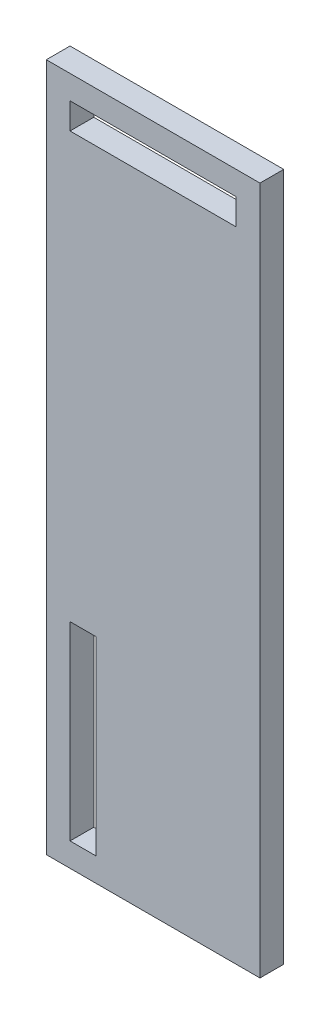
ISO-10303-21;
HEADER;
FILE_DESCRIPTION(('STEP AP214'),'2;1');
FILE_NAME('part.step','',(''),(''),'','','');
FILE_SCHEMA(('AUTOMOTIVE_DESIGN { 1 0 10303 214 1 1 1 1 }'));
ENDSEC;
DATA;
#1=APPLICATION_CONTEXT('core data for automotive mechanical design processes');
#2=APPLICATION_PROTOCOL_DEFINITION('international standard','automotive_design',2000,#1);
#3=PRODUCT_CONTEXT('',#1,'mechanical');
#4=PRODUCT('Part','Part','',(#3));
#5=PRODUCT_RELATED_PRODUCT_CATEGORY('part','',(#4));
#6=PRODUCT_DEFINITION_FORMATION('','',#4);
#7=PRODUCT_DEFINITION_CONTEXT('part definition',#1,'design');
#8=PRODUCT_DEFINITION('design','',#6,#7);
#9=PRODUCT_DEFINITION_SHAPE('','',#8);
#10=(LENGTH_UNIT() NAMED_UNIT(*) SI_UNIT(.MILLI.,.METRE.));
#11=(NAMED_UNIT(*) PLANE_ANGLE_UNIT() SI_UNIT($,.RADIAN.));
#12=(NAMED_UNIT(*) SI_UNIT($,.STERADIAN.) SOLID_ANGLE_UNIT());
#13=UNCERTAINTY_MEASURE_WITH_UNIT(LENGTH_MEASURE(1.E-05),#10,'distance_accuracy_value','');
#14=(GEOMETRIC_REPRESENTATION_CONTEXT(3) GLOBAL_UNCERTAINTY_ASSIGNED_CONTEXT((#13)) GLOBAL_UNIT_ASSIGNED_CONTEXT((#10,
#11,#12)) REPRESENTATION_CONTEXT('',''));
#15=CARTESIAN_POINT('',(0.,0.,0.));
#16=DIRECTION('',(0.,0.,1.));
#17=DIRECTION('',(1.,0.,0.));
#18=AXIS2_PLACEMENT_3D('',#15,#16,#17);
#19=CARTESIAN_POINT('',(28.575,92.075,6.35));
#20=DIRECTION('',(-1.,0.,0.));
#21=DIRECTION('',(0.,0.,1.));
#22=AXIS2_PLACEMENT_3D('',#19,#20,#21);
#23=PLANE('',#22);
#24=DIRECTION('',(0.,1.,0.));
#25=VECTOR('',#24,1.);
#26=CARTESIAN_POINT('',(28.575,92.075,0.));
#27=LINE('',#26,#25);
#28=CARTESIAN_POINT('',(28.575,-92.075,0.));
#29=VERTEX_POINT('',#28);
#30=CARTESIAN_POINT('',(28.575,92.075,0.));
#31=VERTEX_POINT('',#30);
#32=EDGE_CURVE('E181',#29,#31,#27,.T.);
#33=ORIENTED_EDGE('',*,*,#32,.T.);
#34=DIRECTION('',(0.,0.,-1.));
#35=VECTOR('',#34,1.);
#36=CARTESIAN_POINT('',(28.575,92.075,6.35));
#37=LINE('',#36,#35);
#38=CARTESIAN_POINT('',(28.575,92.075,6.35));
#39=VERTEX_POINT('',#38);
#40=EDGE_CURVE('E11',#39,#31,#37,.T.);
#41=ORIENTED_EDGE('',*,*,#40,.F.);
#42=DIRECTION('',(0.,1.,0.));
#43=VECTOR('',#42,1.);
#44=CARTESIAN_POINT('',(28.575,92.075,6.35));
#45=LINE('',#44,#43);
#46=CARTESIAN_POINT('',(28.575,-92.075,6.35));
#47=VERTEX_POINT('',#46);
#48=EDGE_CURVE('E188',#47,#39,#45,.T.);
#49=ORIENTED_EDGE('',*,*,#48,.F.);
#50=DIRECTION('',(0.,0.,-1.));
#51=VECTOR('',#50,1.);
#52=CARTESIAN_POINT('',(28.575,-92.075,6.35));
#53=LINE('',#52,#51);
#54=EDGE_CURVE('E198',#47,#29,#53,.T.);
#55=ORIENTED_EDGE('',*,*,#54,.T.);
#56=EDGE_LOOP('',(#33,#41,#49,#55));
#57=FACE_BOUND('',#56,.T.);
#58=ADVANCED_FACE('F31',(#57),#23,.F.);
#59=CARTESIAN_POINT('',(28.575,92.075,6.35));
#60=DIRECTION('',(0.,-1.,0.));
#61=DIRECTION('',(0.,0.,-1.));
#62=AXIS2_PLACEMENT_3D('',#59,#60,#61);
#63=PLANE('',#62);
#64=DIRECTION('',(-1.,0.,0.));
#65=VECTOR('',#64,1.);
#66=CARTESIAN_POINT('',(28.575,92.075,0.));
#67=LINE('',#66,#65);
#68=CARTESIAN_POINT('',(-28.575,92.075,0.));
#69=VERTEX_POINT('',#68);
#70=EDGE_CURVE('E201',#31,#69,#67,.T.);
#71=ORIENTED_EDGE('',*,*,#70,.T.);
#72=DIRECTION('',(0.,0.,-1.));
#73=VECTOR('',#72,1.);
#74=CARTESIAN_POINT('',(-28.575,92.075,6.35));
#75=LINE('',#74,#73);
#76=CARTESIAN_POINT('',(-28.575,92.075,6.35));
#77=VERTEX_POINT('',#76);
#78=EDGE_CURVE('E38',#77,#69,#75,.T.);
#79=ORIENTED_EDGE('',*,*,#78,.F.);
#80=DIRECTION('',(-1.,0.,0.));
#81=VECTOR('',#80,1.);
#82=CARTESIAN_POINT('',(28.575,92.075,6.35));
#83=LINE('',#82,#81);
#84=EDGE_CURVE('E191',#39,#77,#83,.T.);
#85=ORIENTED_EDGE('',*,*,#84,.F.);
#86=ORIENTED_EDGE('',*,*,#40,.T.);
#87=EDGE_LOOP('',(#71,#79,#85,#86));
#88=FACE_BOUND('',#87,.T.);
#89=ADVANCED_FACE('F230',(#88),#63,.F.);
#90=CARTESIAN_POINT('',(-28.575,92.075,6.35));
#91=DIRECTION('',(1.,0.,0.));
#92=DIRECTION('',(0.,1.,0.));
#93=AXIS2_PLACEMENT_3D('',#90,#91,#92);
#94=PLANE('',#93);
#95=DIRECTION('',(0.,-1.,0.));
#96=VECTOR('',#95,1.);
#97=CARTESIAN_POINT('',(-28.575,92.075,0.));
#98=LINE('',#97,#96);
#99=CARTESIAN_POINT('',(-28.575,-92.075,0.));
#100=VERTEX_POINT('',#99);
#101=EDGE_CURVE('E203',#69,#100,#98,.T.);
#102=ORIENTED_EDGE('',*,*,#101,.T.);
#103=DIRECTION('',(0.,0.,-1.));
#104=VECTOR('',#103,1.);
#105=CARTESIAN_POINT('',(-28.575,-92.075,6.35));
#106=LINE('',#105,#104);
#107=CARTESIAN_POINT('',(-28.575,-92.075,6.35));
#108=VERTEX_POINT('',#107);
#109=EDGE_CURVE('E208',#108,#100,#106,.T.);
#110=ORIENTED_EDGE('',*,*,#109,.F.);
#111=DIRECTION('',(0.,-1.,0.));
#112=VECTOR('',#111,1.);
#113=CARTESIAN_POINT('',(-28.575,92.075,6.35));
#114=LINE('',#113,#112);
#115=EDGE_CURVE('E194',#77,#108,#114,.T.);
#116=ORIENTED_EDGE('',*,*,#115,.F.);
#117=ORIENTED_EDGE('',*,*,#78,.T.);
#118=EDGE_LOOP('',(#102,#110,#116,#117));
#119=FACE_BOUND('',#118,.T.);
#120=ADVANCED_FACE('F215',(#119),#94,.F.);
#121=CARTESIAN_POINT('',(28.575,-92.075,6.35));
#122=DIRECTION('',(0.,1.,0.));
#123=DIRECTION('',(0.,0.,1.));
#124=AXIS2_PLACEMENT_3D('',#121,#122,#123);
#125=PLANE('',#124);
#126=DIRECTION('',(1.,0.,0.));
#127=VECTOR('',#126,1.);
#128=CARTESIAN_POINT('',(28.575,-92.075,0.));
#129=LINE('',#128,#127);
#130=EDGE_CURVE('E192',#100,#29,#129,.T.);
#131=ORIENTED_EDGE('',*,*,#130,.T.);
#132=ORIENTED_EDGE('',*,*,#54,.F.);
#133=DIRECTION('',(1.,0.,0.));
#134=VECTOR('',#133,1.);
#135=CARTESIAN_POINT('',(28.575,-92.075,6.35));
#136=LINE('',#135,#134);
#137=EDGE_CURVE('E196',#108,#47,#136,.T.);
#138=ORIENTED_EDGE('',*,*,#137,.F.);
#139=ORIENTED_EDGE('',*,*,#109,.T.);
#140=EDGE_LOOP('',(#131,#132,#138,#139));
#141=FACE_BOUND('',#140,.T.);
#142=ADVANCED_FACE('F223',(#141),#125,.F.);
#143=CARTESIAN_POINT('',(28.575,-92.075,6.35));
#144=DIRECTION('',(0.,0.,-1.));
#145=DIRECTION('',(-1.,0.,0.));
#146=AXIS2_PLACEMENT_3D('',#143,#144,#145);
#147=PLANE('',#146);
#148=DIRECTION('',(-1.,0.,0.));
#149=VECTOR('',#148,1.);
#150=CARTESIAN_POINT('',(-22.225,-34.925,6.35));
#151=LINE('',#150,#149);
#152=CARTESIAN_POINT('',(-15.24,-34.925,6.35));
#153=VERTEX_POINT('',#152);
#154=CARTESIAN_POINT('',(-22.225,-34.925,6.35));
#155=VERTEX_POINT('',#154);
#156=EDGE_CURVE('E146',#153,#155,#151,.T.);
#157=ORIENTED_EDGE('',*,*,#156,.F.);
#158=DIRECTION('',(0.,1.,0.));
#159=VECTOR('',#158,1.);
#160=CARTESIAN_POINT('',(-15.24,-34.925,6.35));
#161=LINE('',#160,#159);
#162=CARTESIAN_POINT('',(-15.24,-85.725,6.35));
#163=VERTEX_POINT('',#162);
#164=EDGE_CURVE('E45',#163,#153,#161,.T.);
#165=ORIENTED_EDGE('',*,*,#164,.F.);
#166=DIRECTION('',(1.,0.,0.));
#167=VECTOR('',#166,1.);
#168=CARTESIAN_POINT('',(-22.225,-85.725,6.35));
#169=LINE('',#168,#167);
#170=CARTESIAN_POINT('',(-22.225,-85.725,6.35));
#171=VERTEX_POINT('',#170);
#172=EDGE_CURVE('E137',#171,#163,#169,.T.);
#173=ORIENTED_EDGE('',*,*,#172,.F.);
#174=DIRECTION('',(0.,-1.,0.));
#175=VECTOR('',#174,1.);
#176=CARTESIAN_POINT('',(-22.225,-34.925,6.35));
#177=LINE('',#176,#175);
#178=EDGE_CURVE('E140',#155,#171,#177,.T.);
#179=ORIENTED_EDGE('',*,*,#178,.F.);
#180=EDGE_LOOP('',(#157,#165,#173,#179));
#181=FACE_BOUND('',#180,.T.);
#182=DIRECTION('',(-1.,0.,0.));
#183=VECTOR('',#182,1.);
#184=CARTESIAN_POINT('',(-22.225,85.725,6.35));
#185=LINE('',#184,#183);
#186=CARTESIAN_POINT('',(22.225,85.725,6.35));
#187=VERTEX_POINT('',#186);
#188=CARTESIAN_POINT('',(-22.225,85.725,6.35));
#189=VERTEX_POINT('',#188);
#190=EDGE_CURVE('E171',#187,#189,#185,.T.);
#191=ORIENTED_EDGE('',*,*,#190,.F.);
#192=DIRECTION('',(0.,1.,0.));
#193=VECTOR('',#192,1.);
#194=CARTESIAN_POINT('',(22.225,78.74,6.35));
#195=LINE('',#194,#193);
#196=CARTESIAN_POINT('',(22.225,78.74,6.35));
#197=VERTEX_POINT('',#196);
#198=EDGE_CURVE('E152',#197,#187,#195,.T.);
#199=ORIENTED_EDGE('',*,*,#198,.F.);
#200=DIRECTION('',(1.,0.,0.));
#201=VECTOR('',#200,1.);
#202=CARTESIAN_POINT('',(-22.225,78.74,6.35));
#203=LINE('',#202,#201);
#204=CARTESIAN_POINT('',(-22.225,78.74,6.35));
#205=VERTEX_POINT('',#204);
#206=EDGE_CURVE('E160',#205,#197,#203,.T.);
#207=ORIENTED_EDGE('',*,*,#206,.F.);
#208=DIRECTION('',(0.,-1.,0.));
#209=VECTOR('',#208,1.);
#210=CARTESIAN_POINT('',(-22.225,78.74,6.35));
#211=LINE('',#210,#209);
#212=EDGE_CURVE('E174',#189,#205,#211,.T.);
#213=ORIENTED_EDGE('',*,*,#212,.F.);
#214=EDGE_LOOP('',(#191,#199,#207,#213));
#215=FACE_BOUND('',#214,.T.);
#216=ORIENTED_EDGE('',*,*,#48,.T.);
#217=ORIENTED_EDGE('',*,*,#84,.T.);
#218=ORIENTED_EDGE('',*,*,#115,.T.);
#219=ORIENTED_EDGE('',*,*,#137,.T.);
#220=EDGE_LOOP('',(#216,#217,#218,#219));
#221=FACE_BOUND('',#220,.T.);
#222=ADVANCED_FACE('F229',(#181,#215,#221),#147,.F.);
#223=CARTESIAN_POINT('',(28.575,-92.075,0.));
#224=DIRECTION('',(0.,0.,-1.));
#225=DIRECTION('',(-1.,0.,0.));
#226=AXIS2_PLACEMENT_3D('',#223,#224,#225);
#227=PLANE('',#226);
#228=DIRECTION('',(0.,1.,0.));
#229=VECTOR('',#228,1.);
#230=CARTESIAN_POINT('',(-15.24,-34.925,0.));
#231=LINE('',#230,#229);
#232=CARTESIAN_POINT('',(-15.24,-85.725,0.));
#233=VERTEX_POINT('',#232);
#234=CARTESIAN_POINT('',(-15.24,-34.925,0.));
#235=VERTEX_POINT('',#234);
#236=EDGE_CURVE('E121',#233,#235,#231,.T.);
#237=ORIENTED_EDGE('',*,*,#236,.T.);
#238=DIRECTION('',(-1.,0.,0.));
#239=VECTOR('',#238,1.);
#240=CARTESIAN_POINT('',(-22.225,-34.925,0.));
#241=LINE('',#240,#239);
#242=CARTESIAN_POINT('',(-22.225,-34.925,0.));
#243=VERTEX_POINT('',#242);
#244=EDGE_CURVE('E130',#235,#243,#241,.T.);
#245=ORIENTED_EDGE('',*,*,#244,.T.);
#246=DIRECTION('',(0.,-1.,0.));
#247=VECTOR('',#246,1.);
#248=CARTESIAN_POINT('',(-22.225,-34.925,0.));
#249=LINE('',#248,#247);
#250=CARTESIAN_POINT('',(-22.225,-85.725,0.));
#251=VERTEX_POINT('',#250);
#252=EDGE_CURVE('E53',#243,#251,#249,.T.);
#253=ORIENTED_EDGE('',*,*,#252,.T.);
#254=DIRECTION('',(1.,0.,0.));
#255=VECTOR('',#254,1.);
#256=CARTESIAN_POINT('',(-22.225,-85.725,0.));
#257=LINE('',#256,#255);
#258=EDGE_CURVE('E127',#251,#233,#257,.T.);
#259=ORIENTED_EDGE('',*,*,#258,.T.);
#260=EDGE_LOOP('',(#237,#245,#253,#259));
#261=FACE_BOUND('',#260,.T.);
#262=DIRECTION('',(0.,1.,0.));
#263=VECTOR('',#262,1.);
#264=CARTESIAN_POINT('',(22.225,78.74,0.));
#265=LINE('',#264,#263);
#266=CARTESIAN_POINT('',(22.225,78.74,0.));
#267=VERTEX_POINT('',#266);
#268=CARTESIAN_POINT('',(22.225,85.725,0.));
#269=VERTEX_POINT('',#268);
#270=EDGE_CURVE('E156',#267,#269,#265,.T.);
#271=ORIENTED_EDGE('',*,*,#270,.T.);
#272=DIRECTION('',(-1.,0.,0.));
#273=VECTOR('',#272,1.);
#274=CARTESIAN_POINT('',(-22.225,85.725,0.));
#275=LINE('',#274,#273);
#276=CARTESIAN_POINT('',(-22.225,85.725,0.));
#277=VERTEX_POINT('',#276);
#278=EDGE_CURVE('E159',#269,#277,#275,.T.);
#279=ORIENTED_EDGE('',*,*,#278,.T.);
#280=DIRECTION('',(0.,-1.,0.));
#281=VECTOR('',#280,1.);
#282=CARTESIAN_POINT('',(-22.225,78.74,0.));
#283=LINE('',#282,#281);
#284=CARTESIAN_POINT('',(-22.225,78.74,0.));
#285=VERTEX_POINT('',#284);
#286=EDGE_CURVE('E163',#277,#285,#283,.T.);
#287=ORIENTED_EDGE('',*,*,#286,.T.);
#288=DIRECTION('',(1.,0.,0.));
#289=VECTOR('',#288,1.);
#290=CARTESIAN_POINT('',(-22.225,78.74,0.));
#291=LINE('',#290,#289);
#292=EDGE_CURVE('E166',#285,#267,#291,.T.);
#293=ORIENTED_EDGE('',*,*,#292,.T.);
#294=EDGE_LOOP('',(#271,#279,#287,#293));
#295=FACE_BOUND('',#294,.T.);
#296=ORIENTED_EDGE('',*,*,#32,.F.);
#297=ORIENTED_EDGE('',*,*,#130,.F.);
#298=ORIENTED_EDGE('',*,*,#101,.F.);
#299=ORIENTED_EDGE('',*,*,#70,.F.);
#300=EDGE_LOOP('',(#296,#297,#298,#299));
#301=FACE_BOUND('',#300,.T.);
#302=ADVANCED_FACE('F134',(#261,#295,#301),#227,.T.);
#303=CARTESIAN_POINT('',(22.225,78.74,0.));
#304=DIRECTION('',(1.,0.,0.));
#305=DIRECTION('',(0.,0.,-1.));
#306=AXIS2_PLACEMENT_3D('',#303,#304,#305);
#307=PLANE('',#306);
#308=ORIENTED_EDGE('',*,*,#198,.T.);
#309=DIRECTION('',(0.,0.,1.));
#310=VECTOR('',#309,1.);
#311=CARTESIAN_POINT('',(22.225,85.725,0.));
#312=LINE('',#311,#310);
#313=EDGE_CURVE('E169',#269,#187,#312,.T.);
#314=ORIENTED_EDGE('',*,*,#313,.F.);
#315=ORIENTED_EDGE('',*,*,#270,.F.);
#316=DIRECTION('',(0.,0.,1.));
#317=VECTOR('',#316,1.);
#318=CARTESIAN_POINT('',(22.225,78.74,0.));
#319=LINE('',#318,#317);
#320=EDGE_CURVE('E179',#267,#197,#319,.T.);
#321=ORIENTED_EDGE('',*,*,#320,.T.);
#322=EDGE_LOOP('',(#308,#314,#315,#321));
#323=FACE_BOUND('',#322,.T.);
#324=ADVANCED_FACE('F242',(#323),#307,.F.);
#325=CARTESIAN_POINT('',(-22.225,78.74,0.));
#326=DIRECTION('',(0.,-1.,0.));
#327=DIRECTION('',(0.,0.,-1.));
#328=AXIS2_PLACEMENT_3D('',#325,#326,#327);
#329=PLANE('',#328);
#330=ORIENTED_EDGE('',*,*,#206,.T.);
#331=ORIENTED_EDGE('',*,*,#320,.F.);
#332=ORIENTED_EDGE('',*,*,#292,.F.);
#333=DIRECTION('',(0.,0.,1.));
#334=VECTOR('',#333,1.);
#335=CARTESIAN_POINT('',(-22.225,78.74,0.));
#336=LINE('',#335,#334);
#337=EDGE_CURVE('E182',#285,#205,#336,.T.);
#338=ORIENTED_EDGE('',*,*,#337,.T.);
#339=EDGE_LOOP('',(#330,#331,#332,#338));
#340=FACE_BOUND('',#339,.T.);
#341=ADVANCED_FACE('F248',(#340),#329,.F.);
#342=CARTESIAN_POINT('',(-22.225,78.74,0.));
#343=DIRECTION('',(-1.,0.,0.));
#344=DIRECTION('',(0.,-1.,0.));
#345=AXIS2_PLACEMENT_3D('',#342,#343,#344);
#346=PLANE('',#345);
#347=ORIENTED_EDGE('',*,*,#212,.T.);
#348=ORIENTED_EDGE('',*,*,#337,.F.);
#349=ORIENTED_EDGE('',*,*,#286,.F.);
#350=DIRECTION('',(0.,0.,1.));
#351=VECTOR('',#350,1.);
#352=CARTESIAN_POINT('',(-22.225,85.725,0.));
#353=LINE('',#352,#351);
#354=EDGE_CURVE('E184',#277,#189,#353,.T.);
#355=ORIENTED_EDGE('',*,*,#354,.T.);
#356=EDGE_LOOP('',(#347,#348,#349,#355));
#357=FACE_BOUND('',#356,.T.);
#358=ADVANCED_FACE('F253',(#357),#346,.F.);
#359=CARTESIAN_POINT('',(-22.225,85.725,0.));
#360=DIRECTION('',(0.,1.,0.));
#361=DIRECTION('',(0.,0.,1.));
#362=AXIS2_PLACEMENT_3D('',#359,#360,#361);
#363=PLANE('',#362);
#364=ORIENTED_EDGE('',*,*,#190,.T.);
#365=ORIENTED_EDGE('',*,*,#354,.F.);
#366=ORIENTED_EDGE('',*,*,#278,.F.);
#367=ORIENTED_EDGE('',*,*,#313,.T.);
#368=EDGE_LOOP('',(#364,#365,#366,#367));
#369=FACE_BOUND('',#368,.T.);
#370=ADVANCED_FACE('F250',(#369),#363,.F.);
#371=CARTESIAN_POINT('',(-15.24,-34.925,0.));
#372=DIRECTION('',(1.,0.,0.));
#373=DIRECTION('',(0.,1.,0.));
#374=AXIS2_PLACEMENT_3D('',#371,#372,#373);
#375=PLANE('',#374);
#376=ORIENTED_EDGE('',*,*,#164,.T.);
#377=DIRECTION('',(0.,0.,1.));
#378=VECTOR('',#377,1.);
#379=CARTESIAN_POINT('',(-15.24,-34.925,0.));
#380=LINE('',#379,#378);
#381=EDGE_CURVE('E117',#235,#153,#380,.T.);
#382=ORIENTED_EDGE('',*,*,#381,.F.);
#383=ORIENTED_EDGE('',*,*,#236,.F.);
#384=DIRECTION('',(0.,0.,1.));
#385=VECTOR('',#384,1.);
#386=CARTESIAN_POINT('',(-15.24,-85.725,0.));
#387=LINE('',#386,#385);
#388=EDGE_CURVE('E150',#233,#163,#387,.T.);
#389=ORIENTED_EDGE('',*,*,#388,.T.);
#390=EDGE_LOOP('',(#376,#382,#383,#389));
#391=FACE_BOUND('',#390,.T.);
#392=ADVANCED_FACE('F119',(#391),#375,.F.);
#393=CARTESIAN_POINT('',(-22.225,-85.725,0.));
#394=DIRECTION('',(0.,-1.,0.));
#395=DIRECTION('',(0.,0.,-1.));
#396=AXIS2_PLACEMENT_3D('',#393,#394,#395);
#397=PLANE('',#396);
#398=ORIENTED_EDGE('',*,*,#172,.T.);
#399=ORIENTED_EDGE('',*,*,#388,.F.);
#400=ORIENTED_EDGE('',*,*,#258,.F.);
#401=DIRECTION('',(0.,0.,1.));
#402=VECTOR('',#401,1.);
#403=CARTESIAN_POINT('',(-22.225,-85.725,0.));
#404=LINE('',#403,#402);
#405=EDGE_CURVE('E153',#251,#171,#404,.T.);
#406=ORIENTED_EDGE('',*,*,#405,.T.);
#407=EDGE_LOOP('',(#398,#399,#400,#406));
#408=FACE_BOUND('',#407,.T.);
#409=ADVANCED_FACE('F263',(#408),#397,.F.);
#410=CARTESIAN_POINT('',(-22.225,-34.925,0.));
#411=DIRECTION('',(-1.,0.,0.));
#412=DIRECTION('',(0.,-1.,0.));
#413=AXIS2_PLACEMENT_3D('',#410,#411,#412);
#414=PLANE('',#413);
#415=ORIENTED_EDGE('',*,*,#178,.T.);
#416=ORIENTED_EDGE('',*,*,#405,.F.);
#417=ORIENTED_EDGE('',*,*,#252,.F.);
#418=DIRECTION('',(0.,0.,1.));
#419=VECTOR('',#418,1.);
#420=CARTESIAN_POINT('',(-22.225,-34.925,0.));
#421=LINE('',#420,#419);
#422=EDGE_CURVE('E126',#243,#155,#421,.T.);
#423=ORIENTED_EDGE('',*,*,#422,.T.);
#424=EDGE_LOOP('',(#415,#416,#417,#423));
#425=FACE_BOUND('',#424,.T.);
#426=ADVANCED_FACE('F266',(#425),#414,.F.);
#427=CARTESIAN_POINT('',(-22.225,-34.925,0.));
#428=DIRECTION('',(0.,1.,0.));
#429=DIRECTION('',(0.,0.,1.));
#430=AXIS2_PLACEMENT_3D('',#427,#428,#429);
#431=PLANE('',#430);
#432=ORIENTED_EDGE('',*,*,#156,.T.);
#433=ORIENTED_EDGE('',*,*,#422,.F.);
#434=ORIENTED_EDGE('',*,*,#244,.F.);
#435=ORIENTED_EDGE('',*,*,#381,.T.);
#436=EDGE_LOOP('',(#432,#433,#434,#435));
#437=FACE_BOUND('',#436,.T.);
#438=ADVANCED_FACE('F131',(#437),#431,.F.);
#439=CLOSED_SHELL('',(#58,#89,#120,#142,#222,#302,#324,#341,#358,#370,#392,#409,#426,#438));
#440=MANIFOLD_SOLID_BREP('B2',#439);
#441=ADVANCED_BREP_SHAPE_REPRESENTATION('',(#18,#440),#14);
#442=SHAPE_DEFINITION_REPRESENTATION(#9,#441);
ENDSEC;
END-ISO-10303-21;
